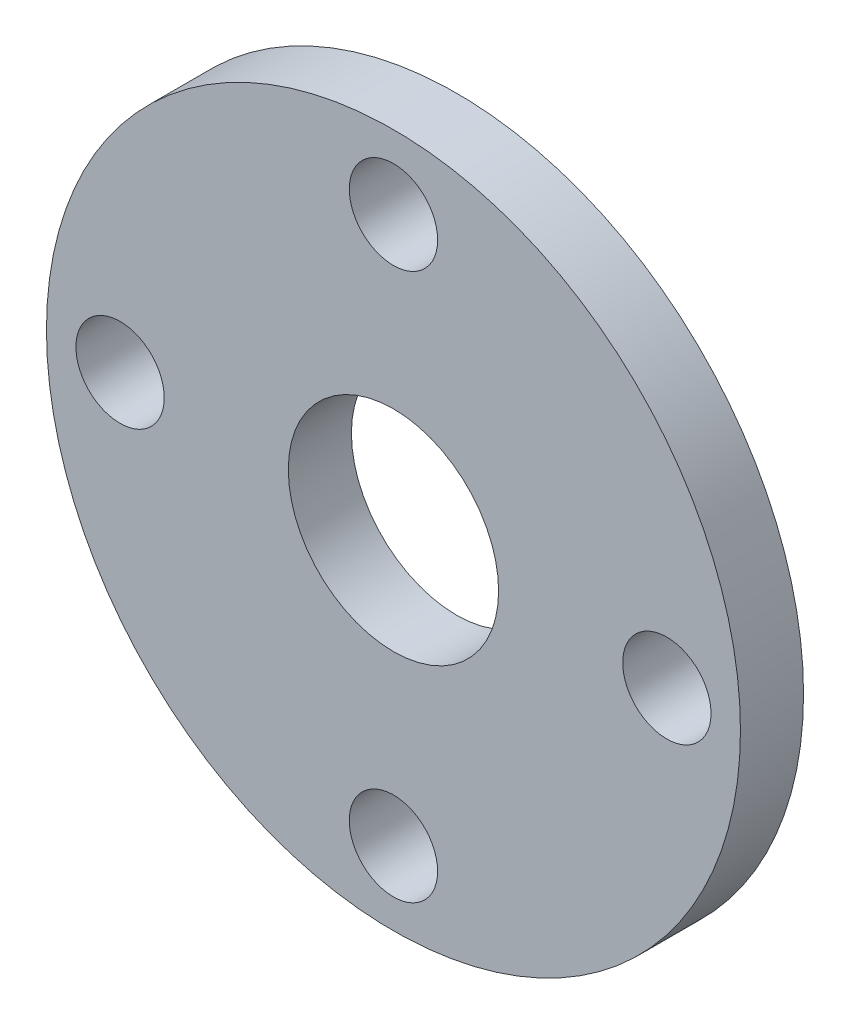
ISO-10303-21;
HEADER;
FILE_DESCRIPTION(('STEP AP214'),'2;1');
FILE_NAME('part.step','',(''),(''),'','','');
FILE_SCHEMA(('AUTOMOTIVE_DESIGN { 1 0 10303 214 1 1 1 1 }'));
ENDSEC;
DATA;
#1=APPLICATION_CONTEXT('core data for automotive mechanical design processes');
#2=APPLICATION_PROTOCOL_DEFINITION('international standard','automotive_design',2000,#1);
#3=PRODUCT_CONTEXT('',#1,'mechanical');
#4=PRODUCT('Part','Part','',(#3));
#5=PRODUCT_RELATED_PRODUCT_CATEGORY('part','',(#4));
#6=PRODUCT_DEFINITION_FORMATION('','',#4);
#7=PRODUCT_DEFINITION_CONTEXT('part definition',#1,'design');
#8=PRODUCT_DEFINITION('design','',#6,#7);
#9=PRODUCT_DEFINITION_SHAPE('','',#8);
#10=(LENGTH_UNIT() NAMED_UNIT(*) SI_UNIT(.MILLI.,.METRE.));
#11=(NAMED_UNIT(*) PLANE_ANGLE_UNIT() SI_UNIT($,.RADIAN.));
#12=(NAMED_UNIT(*) SI_UNIT($,.STERADIAN.) SOLID_ANGLE_UNIT());
#13=UNCERTAINTY_MEASURE_WITH_UNIT(LENGTH_MEASURE(1.E-05),#10,'distance_accuracy_value','');
#14=(GEOMETRIC_REPRESENTATION_CONTEXT(3) GLOBAL_UNCERTAINTY_ASSIGNED_CONTEXT((#13)) GLOBAL_UNIT_ASSIGNED_CONTEXT((#10,
#11,#12)) REPRESENTATION_CONTEXT('',''));
#15=CARTESIAN_POINT('',(0.,0.,0.));
#16=DIRECTION('',(0.,0.,1.));
#17=DIRECTION('',(1.,0.,0.));
#18=AXIS2_PLACEMENT_3D('',#15,#16,#17);
#19=CARTESIAN_POINT('',(0.,0.,3.));
#20=DIRECTION('',(0.,0.,1.));
#21=DIRECTION('',(1.,0.,0.));
#22=AXIS2_PLACEMENT_3D('',#19,#20,#21);
#23=PLANE('',#22);
#24=CARTESIAN_POINT('',(-13.,0.,3.));
#25=DIRECTION('',(0.,0.,1.));
#26=DIRECTION('',(1.,0.,0.));
#27=AXIS2_PLACEMENT_3D('',#24,#25,#26);
#28=CIRCLE('',#27,2.1);
#29=CARTESIAN_POINT('',(-10.9,0.,3.));
#30=VERTEX_POINT('',#29);
#31=EDGE_CURVE('E62',#30,#30,#28,.T.);
#32=ORIENTED_EDGE('',*,*,#31,.F.);
#33=EDGE_LOOP('',(#32));
#34=FACE_BOUND('',#33,.T.);
#35=CARTESIAN_POINT('',(13.,0.,3.));
#36=DIRECTION('',(0.,0.,1.));
#37=DIRECTION('',(1.,0.,0.));
#38=AXIS2_PLACEMENT_3D('',#35,#36,#37);
#39=CIRCLE('',#38,2.1);
#40=CARTESIAN_POINT('',(15.1,0.,3.));
#41=VERTEX_POINT('',#40);
#42=EDGE_CURVE('E50',#41,#41,#39,.T.);
#43=ORIENTED_EDGE('',*,*,#42,.F.);
#44=EDGE_LOOP('',(#43));
#45=FACE_BOUND('',#44,.T.);
#46=CARTESIAN_POINT('',(0.,0.,3.));
#47=DIRECTION('',(0.,0.,1.));
#48=DIRECTION('',(1.,0.,0.));
#49=AXIS2_PLACEMENT_3D('',#46,#47,#48);
#50=CIRCLE('',#49,16.5);
#51=CARTESIAN_POINT('',(16.5,0.,3.));
#52=VERTEX_POINT('',#51);
#53=EDGE_CURVE('E10',#52,#52,#50,.T.);
#54=ORIENTED_EDGE('',*,*,#53,.T.);
#55=EDGE_LOOP('',(#54));
#56=FACE_BOUND('',#55,.T.);
#57=CARTESIAN_POINT('',(0.,13.,3.));
#58=DIRECTION('',(0.,0.,1.));
#59=DIRECTION('',(1.,0.,0.));
#60=AXIS2_PLACEMENT_3D('',#57,#58,#59);
#61=CIRCLE('',#60,2.1);
#62=CARTESIAN_POINT('',(2.1,13.,3.));
#63=VERTEX_POINT('',#62);
#64=EDGE_CURVE('E45',#63,#63,#61,.T.);
#65=ORIENTED_EDGE('',*,*,#64,.F.);
#66=EDGE_LOOP('',(#65));
#67=FACE_BOUND('',#66,.T.);
#68=CARTESIAN_POINT('',(0.,-13.,3.));
#69=DIRECTION('',(0.,0.,1.));
#70=DIRECTION('',(1.,0.,0.));
#71=AXIS2_PLACEMENT_3D('',#68,#69,#70);
#72=CIRCLE('',#71,2.1);
#73=CARTESIAN_POINT('',(2.1,-13.,3.));
#74=VERTEX_POINT('',#73);
#75=EDGE_CURVE('E56',#74,#74,#72,.T.);
#76=ORIENTED_EDGE('',*,*,#75,.F.);
#77=EDGE_LOOP('',(#76));
#78=FACE_BOUND('',#77,.T.);
#79=CARTESIAN_POINT('',(0.,0.,3.));
#80=DIRECTION('',(0.,0.,1.));
#81=DIRECTION('',(1.,0.,0.));
#82=AXIS2_PLACEMENT_3D('',#79,#80,#81);
#83=CIRCLE('',#82,5.);
#84=CARTESIAN_POINT('',(5.,0.,3.));
#85=VERTEX_POINT('',#84);
#86=EDGE_CURVE('E68',#85,#85,#83,.T.);
#87=ORIENTED_EDGE('',*,*,#86,.F.);
#88=EDGE_LOOP('',(#87));
#89=FACE_BOUND('',#88,.T.);
#90=ADVANCED_FACE('F34',(#34,#45,#56,#67,#78,#89),#23,.T.);
#91=CARTESIAN_POINT('',(0.,0.,0.));
#92=DIRECTION('',(0.,0.,1.));
#93=DIRECTION('',(1.,0.,0.));
#94=AXIS2_PLACEMENT_3D('',#91,#92,#93);
#95=PLANE('',#94);
#96=CARTESIAN_POINT('',(0.,0.,0.));
#97=DIRECTION('',(0.,0.,1.));
#98=DIRECTION('',(1.,0.,0.));
#99=AXIS2_PLACEMENT_3D('',#96,#97,#98);
#100=CIRCLE('',#99,16.5);
#101=CARTESIAN_POINT('',(16.5,0.,0.));
#102=VERTEX_POINT('',#101);
#103=EDGE_CURVE('E38',#102,#102,#100,.T.);
#104=ORIENTED_EDGE('',*,*,#103,.F.);
#105=EDGE_LOOP('',(#104));
#106=FACE_BOUND('',#105,.T.);
#107=CARTESIAN_POINT('',(0.,13.,0.));
#108=DIRECTION('',(0.,0.,1.));
#109=DIRECTION('',(1.,0.,0.));
#110=AXIS2_PLACEMENT_3D('',#107,#108,#109);
#111=CIRCLE('',#110,2.1);
#112=CARTESIAN_POINT('',(2.1,13.,0.));
#113=VERTEX_POINT('',#112);
#114=EDGE_CURVE('E47',#113,#113,#111,.T.);
#115=ORIENTED_EDGE('',*,*,#114,.T.);
#116=EDGE_LOOP('',(#115));
#117=FACE_BOUND('',#116,.T.);
#118=CARTESIAN_POINT('',(13.,0.,0.));
#119=DIRECTION('',(0.,0.,1.));
#120=DIRECTION('',(1.,0.,0.));
#121=AXIS2_PLACEMENT_3D('',#118,#119,#120);
#122=CIRCLE('',#121,2.1);
#123=CARTESIAN_POINT('',(15.1,0.,0.));
#124=VERTEX_POINT('',#123);
#125=EDGE_CURVE('E53',#124,#124,#122,.T.);
#126=ORIENTED_EDGE('',*,*,#125,.T.);
#127=EDGE_LOOP('',(#126));
#128=FACE_BOUND('',#127,.T.);
#129=CARTESIAN_POINT('',(0.,-13.,0.));
#130=DIRECTION('',(0.,0.,1.));
#131=DIRECTION('',(1.,0.,0.));
#132=AXIS2_PLACEMENT_3D('',#129,#130,#131);
#133=CIRCLE('',#132,2.1);
#134=CARTESIAN_POINT('',(2.1,-13.,0.));
#135=VERTEX_POINT('',#134);
#136=EDGE_CURVE('E59',#135,#135,#133,.T.);
#137=ORIENTED_EDGE('',*,*,#136,.T.);
#138=EDGE_LOOP('',(#137));
#139=FACE_BOUND('',#138,.T.);
#140=CARTESIAN_POINT('',(-13.,0.,0.));
#141=DIRECTION('',(0.,0.,1.));
#142=DIRECTION('',(1.,0.,0.));
#143=AXIS2_PLACEMENT_3D('',#140,#141,#142);
#144=CIRCLE('',#143,2.1);
#145=CARTESIAN_POINT('',(-10.9,0.,0.));
#146=VERTEX_POINT('',#145);
#147=EDGE_CURVE('E65',#146,#146,#144,.T.);
#148=ORIENTED_EDGE('',*,*,#147,.T.);
#149=EDGE_LOOP('',(#148));
#150=FACE_BOUND('',#149,.T.);
#151=CARTESIAN_POINT('',(0.,0.,0.));
#152=DIRECTION('',(0.,0.,1.));
#153=DIRECTION('',(1.,0.,0.));
#154=AXIS2_PLACEMENT_3D('',#151,#152,#153);
#155=CIRCLE('',#154,5.);
#156=CARTESIAN_POINT('',(5.,0.,0.));
#157=VERTEX_POINT('',#156);
#158=EDGE_CURVE('E71',#157,#157,#155,.T.);
#159=ORIENTED_EDGE('',*,*,#158,.T.);
#160=EDGE_LOOP('',(#159));
#161=FACE_BOUND('',#160,.T.);
#162=ADVANCED_FACE('F81',(#106,#117,#128,#139,#150,#161),#95,.F.);
#163=CARTESIAN_POINT('',(0.,0.,3.));
#164=DIRECTION('',(0.,0.,-1.));
#165=DIRECTION('',(-1.,0.,0.));
#166=AXIS2_PLACEMENT_3D('',#163,#164,#165);
#167=CYLINDRICAL_SURFACE('',#166,16.5);
#168=ORIENTED_EDGE('',*,*,#53,.F.);
#169=EDGE_LOOP('',(#168));
#170=FACE_BOUND('',#169,.T.);
#171=ORIENTED_EDGE('',*,*,#103,.T.);
#172=EDGE_LOOP('',(#171));
#173=FACE_BOUND('',#172,.T.);
#174=ADVANCED_FACE('F36',(#170,#173),#167,.T.);
#175=CARTESIAN_POINT('',(0.,13.,3.));
#176=DIRECTION('',(0.,0.,-1.));
#177=DIRECTION('',(-1.,0.,0.));
#178=AXIS2_PLACEMENT_3D('',#175,#176,#177);
#179=CYLINDRICAL_SURFACE('',#178,2.1);
#180=ORIENTED_EDGE('',*,*,#64,.T.);
#181=EDGE_LOOP('',(#180));
#182=FACE_BOUND('',#181,.T.);
#183=ORIENTED_EDGE('',*,*,#114,.F.);
#184=EDGE_LOOP('',(#183));
#185=FACE_BOUND('',#184,.T.);
#186=ADVANCED_FACE('F91',(#182,#185),#179,.F.);
#187=CARTESIAN_POINT('',(13.,0.,3.));
#188=DIRECTION('',(0.,0.,-1.));
#189=DIRECTION('',(-1.,0.,0.));
#190=AXIS2_PLACEMENT_3D('',#187,#188,#189);
#191=CYLINDRICAL_SURFACE('',#190,2.1);
#192=ORIENTED_EDGE('',*,*,#42,.T.);
#193=EDGE_LOOP('',(#192));
#194=FACE_BOUND('',#193,.T.);
#195=ORIENTED_EDGE('',*,*,#125,.F.);
#196=EDGE_LOOP('',(#195));
#197=FACE_BOUND('',#196,.T.);
#198=ADVANCED_FACE('F94',(#194,#197),#191,.F.);
#199=CARTESIAN_POINT('',(0.,-13.,3.));
#200=DIRECTION('',(0.,0.,-1.));
#201=DIRECTION('',(-1.,0.,0.));
#202=AXIS2_PLACEMENT_3D('',#199,#200,#201);
#203=CYLINDRICAL_SURFACE('',#202,2.1);
#204=ORIENTED_EDGE('',*,*,#75,.T.);
#205=EDGE_LOOP('',(#204));
#206=FACE_BOUND('',#205,.T.);
#207=ORIENTED_EDGE('',*,*,#136,.F.);
#208=EDGE_LOOP('',(#207));
#209=FACE_BOUND('',#208,.T.);
#210=ADVANCED_FACE('F98',(#206,#209),#203,.F.);
#211=CARTESIAN_POINT('',(-13.,0.,3.));
#212=DIRECTION('',(0.,0.,-1.));
#213=DIRECTION('',(-1.,0.,0.));
#214=AXIS2_PLACEMENT_3D('',#211,#212,#213);
#215=CYLINDRICAL_SURFACE('',#214,2.1);
#216=ORIENTED_EDGE('',*,*,#31,.T.);
#217=EDGE_LOOP('',(#216));
#218=FACE_BOUND('',#217,.T.);
#219=ORIENTED_EDGE('',*,*,#147,.F.);
#220=EDGE_LOOP('',(#219));
#221=FACE_BOUND('',#220,.T.);
#222=ADVANCED_FACE('F102',(#218,#221),#215,.F.);
#223=CARTESIAN_POINT('',(0.,0.,3.));
#224=DIRECTION('',(0.,0.,-1.));
#225=DIRECTION('',(-1.,0.,0.));
#226=AXIS2_PLACEMENT_3D('',#223,#224,#225);
#227=CYLINDRICAL_SURFACE('',#226,5.);
#228=ORIENTED_EDGE('',*,*,#86,.T.);
#229=EDGE_LOOP('',(#228));
#230=FACE_BOUND('',#229,.T.);
#231=ORIENTED_EDGE('',*,*,#158,.F.);
#232=EDGE_LOOP('',(#231));
#233=FACE_BOUND('',#232,.T.);
#234=ADVANCED_FACE('F77',(#230,#233),#227,.F.);
#235=CLOSED_SHELL('',(#90,#162,#174,#186,#198,#210,#222,#234));
#236=MANIFOLD_SOLID_BREP('B2',#235);
#237=ADVANCED_BREP_SHAPE_REPRESENTATION('',(#18,#236),#14);
#238=SHAPE_DEFINITION_REPRESENTATION(#9,#237);
ENDSEC;
END-ISO-10303-21;
